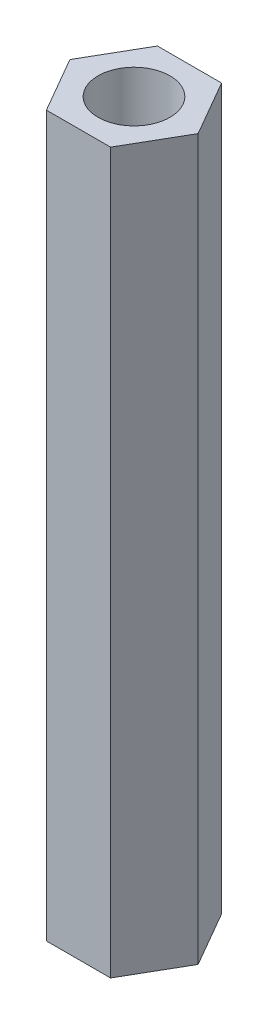
ISO-10303-21;
HEADER;
FILE_DESCRIPTION(('STEP AP214'),'2;1');
FILE_NAME('part.step','',(''),(''),'','','');
FILE_SCHEMA(('AUTOMOTIVE_DESIGN { 1 0 10303 214 1 1 1 1 }'));
ENDSEC;
DATA;
#1=APPLICATION_CONTEXT('core data for automotive mechanical design processes');
#2=APPLICATION_PROTOCOL_DEFINITION('international standard','automotive_design',2000,#1);
#3=PRODUCT_CONTEXT('',#1,'mechanical');
#4=PRODUCT('Part','Part','',(#3));
#5=PRODUCT_RELATED_PRODUCT_CATEGORY('part','',(#4));
#6=PRODUCT_DEFINITION_FORMATION('','',#4);
#7=PRODUCT_DEFINITION_CONTEXT('part definition',#1,'design');
#8=PRODUCT_DEFINITION('design','',#6,#7);
#9=PRODUCT_DEFINITION_SHAPE('','',#8);
#10=(LENGTH_UNIT() NAMED_UNIT(*) SI_UNIT(.MILLI.,.METRE.));
#11=(NAMED_UNIT(*) PLANE_ANGLE_UNIT() SI_UNIT($,.RADIAN.));
#12=(NAMED_UNIT(*) SI_UNIT($,.STERADIAN.) SOLID_ANGLE_UNIT());
#13=UNCERTAINTY_MEASURE_WITH_UNIT(LENGTH_MEASURE(1.E-05),#10,'distance_accuracy_value','');
#14=(GEOMETRIC_REPRESENTATION_CONTEXT(3) GLOBAL_UNCERTAINTY_ASSIGNED_CONTEXT((#13)) GLOBAL_UNIT_ASSIGNED_CONTEXT((#10,
#11,#12)) REPRESENTATION_CONTEXT('',''));
#15=CARTESIAN_POINT('',(0.,0.,0.));
#16=DIRECTION('',(0.,0.,1.));
#17=DIRECTION('',(1.,0.,0.));
#18=AXIS2_PLACEMENT_3D('',#15,#16,#17);
#19=CARTESIAN_POINT('',(0.,30.,0.));
#20=DIRECTION('',(0.,1.,0.));
#21=DIRECTION('',(0.,0.,1.));
#22=AXIS2_PLACEMENT_3D('',#19,#20,#21);
#23=PLANE('',#22);
#24=DIRECTION('',(0.5,0.,-0.866025403784439));
#25=VECTOR('',#24,1.);
#26=CARTESIAN_POINT('',(1.33656587317398,30.,2.315));
#27=LINE('',#26,#25);
#28=CARTESIAN_POINT('',(1.33656587317398,30.,2.315));
#29=VERTEX_POINT('',#28);
#30=CARTESIAN_POINT('',(2.67313174634797,30.,0.));
#31=VERTEX_POINT('',#30);
#32=EDGE_CURVE('E148',#29,#31,#27,.T.);
#33=ORIENTED_EDGE('',*,*,#32,.T.);
#34=DIRECTION('',(-0.5,0.,-0.866025403784438));
#35=VECTOR('',#34,1.);
#36=CARTESIAN_POINT('',(2.67313174634797,30.,0.));
#37=LINE('',#36,#35);
#38=CARTESIAN_POINT('',(1.33656587317398,30.,-2.315));
#39=VERTEX_POINT('',#38);
#40=EDGE_CURVE('E96',#31,#39,#37,.T.);
#41=ORIENTED_EDGE('',*,*,#40,.T.);
#42=DIRECTION('',(-1.,0.,0.));
#43=VECTOR('',#42,1.);
#44=CARTESIAN_POINT('',(1.33656587317398,30.,-2.315));
#45=LINE('',#44,#43);
#46=CARTESIAN_POINT('',(-1.33656587317398,30.,-2.315));
#47=VERTEX_POINT('',#46);
#48=EDGE_CURVE('E109',#39,#47,#45,.T.);
#49=ORIENTED_EDGE('',*,*,#48,.T.);
#50=DIRECTION('',(-0.5,0.,0.866025403784439));
#51=VECTOR('',#50,1.);
#52=CARTESIAN_POINT('',(-1.33656587317398,30.,-2.315));
#53=LINE('',#52,#51);
#54=CARTESIAN_POINT('',(-2.67313174634797,30.,0.));
#55=VERTEX_POINT('',#54);
#56=EDGE_CURVE('E103',#47,#55,#53,.T.);
#57=ORIENTED_EDGE('',*,*,#56,.T.);
#58=DIRECTION('',(0.5,0.,0.866025403784439));
#59=VECTOR('',#58,1.);
#60=CARTESIAN_POINT('',(-2.67313174634797,30.,0.));
#61=LINE('',#60,#59);
#62=CARTESIAN_POINT('',(-1.33656587317398,30.,2.315));
#63=VERTEX_POINT('',#62);
#64=EDGE_CURVE('E107',#55,#63,#61,.T.);
#65=ORIENTED_EDGE('',*,*,#64,.T.);
#66=DIRECTION('',(1.,0.,0.));
#67=VECTOR('',#66,1.);
#68=CARTESIAN_POINT('',(-1.33656587317398,30.,2.315));
#69=LINE('',#68,#67);
#70=EDGE_CURVE('E59',#63,#29,#69,.T.);
#71=ORIENTED_EDGE('',*,*,#70,.T.);
#72=EDGE_LOOP('',(#33,#41,#49,#57,#65,#71));
#73=FACE_BOUND('',#72,.T.);
#74=CARTESIAN_POINT('',(0.,30.,0.));
#75=DIRECTION('',(0.,1.,0.));
#76=DIRECTION('',(0.,0.,1.));
#77=AXIS2_PLACEMENT_3D('',#74,#75,#76);
#78=CIRCLE('',#77,1.5);
#79=CARTESIAN_POINT('',(0.,30.,1.5));
#80=VERTEX_POINT('',#79);
#81=EDGE_CURVE('E136',#80,#80,#78,.T.);
#82=ORIENTED_EDGE('',*,*,#81,.F.);
#83=EDGE_LOOP('',(#82));
#84=FACE_BOUND('',#83,.T.);
#85=ADVANCED_FACE('F41',(#73,#84),#23,.T.);
#86=CARTESIAN_POINT('',(0.,0.,0.));
#87=DIRECTION('',(0.,1.,0.));
#88=DIRECTION('',(0.,0.,1.));
#89=AXIS2_PLACEMENT_3D('',#86,#87,#88);
#90=PLANE('',#89);
#91=DIRECTION('',(0.5,0.,-0.866025403784439));
#92=VECTOR('',#91,1.);
#93=CARTESIAN_POINT('',(1.33656587317398,0.,2.315));
#94=LINE('',#93,#92);
#95=CARTESIAN_POINT('',(1.33656587317398,0.,2.315));
#96=VERTEX_POINT('',#95);
#97=CARTESIAN_POINT('',(2.67313174634797,0.,0.));
#98=VERTEX_POINT('',#97);
#99=EDGE_CURVE('E131',#96,#98,#94,.T.);
#100=ORIENTED_EDGE('',*,*,#99,.F.);
#101=DIRECTION('',(1.,0.,0.));
#102=VECTOR('',#101,1.);
#103=CARTESIAN_POINT('',(-1.33656587317398,0.,2.315));
#104=LINE('',#103,#102);
#105=CARTESIAN_POINT('',(-1.33656587317398,0.,2.315));
#106=VERTEX_POINT('',#105);
#107=EDGE_CURVE('E88',#106,#96,#104,.T.);
#108=ORIENTED_EDGE('',*,*,#107,.F.);
#109=DIRECTION('',(0.5,0.,0.866025403784439));
#110=VECTOR('',#109,1.);
#111=CARTESIAN_POINT('',(-2.67313174634797,0.,0.));
#112=LINE('',#111,#110);
#113=CARTESIAN_POINT('',(-2.67313174634797,0.,0.));
#114=VERTEX_POINT('',#113);
#115=EDGE_CURVE('E82',#114,#106,#112,.T.);
#116=ORIENTED_EDGE('',*,*,#115,.F.);
#117=DIRECTION('',(-0.5,0.,0.866025403784439));
#118=VECTOR('',#117,1.);
#119=CARTESIAN_POINT('',(-1.33656587317398,0.,-2.315));
#120=LINE('',#119,#118);
#121=CARTESIAN_POINT('',(-1.33656587317398,0.,-2.315));
#122=VERTEX_POINT('',#121);
#123=EDGE_CURVE('E118',#122,#114,#120,.T.);
#124=ORIENTED_EDGE('',*,*,#123,.F.);
#125=DIRECTION('',(-1.,0.,0.));
#126=VECTOR('',#125,1.);
#127=CARTESIAN_POINT('',(1.33656587317398,0.,-2.315));
#128=LINE('',#127,#126);
#129=CARTESIAN_POINT('',(1.33656587317398,0.,-2.315));
#130=VERTEX_POINT('',#129);
#131=EDGE_CURVE('E139',#130,#122,#128,.T.);
#132=ORIENTED_EDGE('',*,*,#131,.F.);
#133=DIRECTION('',(-0.5,0.,-0.866025403784438));
#134=VECTOR('',#133,1.);
#135=CARTESIAN_POINT('',(2.67313174634797,0.,0.));
#136=LINE('',#135,#134);
#137=EDGE_CURVE('E135',#98,#130,#136,.T.);
#138=ORIENTED_EDGE('',*,*,#137,.F.);
#139=EDGE_LOOP('',(#100,#108,#116,#124,#132,#138));
#140=FACE_BOUND('',#139,.T.);
#141=CARTESIAN_POINT('',(0.,0.,0.));
#142=DIRECTION('',(0.,1.,0.));
#143=DIRECTION('',(0.,0.,1.));
#144=AXIS2_PLACEMENT_3D('',#141,#142,#143);
#145=CIRCLE('',#144,1.5);
#146=CARTESIAN_POINT('',(0.,0.,1.5));
#147=VERTEX_POINT('',#146);
#148=EDGE_CURVE('E245',#147,#147,#145,.T.);
#149=ORIENTED_EDGE('',*,*,#148,.T.);
#150=EDGE_LOOP('',(#149));
#151=FACE_BOUND('',#150,.T.);
#152=ADVANCED_FACE('F161',(#140,#151),#90,.F.);
#153=CARTESIAN_POINT('',(1.33656587317398,30.,2.315));
#154=DIRECTION('',(-0.866025403784439,0.,-0.5));
#155=DIRECTION('',(-0.5,0.,0.866025403784439));
#156=AXIS2_PLACEMENT_3D('',#153,#154,#155);
#157=PLANE('',#156);
#158=ORIENTED_EDGE('',*,*,#99,.T.);
#159=DIRECTION('',(0.,-1.,0.));
#160=VECTOR('',#159,1.);
#161=CARTESIAN_POINT('',(2.67313174634797,30.,0.));
#162=LINE('',#161,#160);
#163=EDGE_CURVE('E11',#31,#98,#162,.T.);
#164=ORIENTED_EDGE('',*,*,#163,.F.);
#165=ORIENTED_EDGE('',*,*,#32,.F.);
#166=DIRECTION('',(0.,-1.,0.));
#167=VECTOR('',#166,1.);
#168=CARTESIAN_POINT('',(1.33656587317398,30.,2.315));
#169=LINE('',#168,#167);
#170=EDGE_CURVE('E127',#29,#96,#169,.T.);
#171=ORIENTED_EDGE('',*,*,#170,.T.);
#172=EDGE_LOOP('',(#158,#164,#165,#171));
#173=FACE_BOUND('',#172,.T.);
#174=ADVANCED_FACE('F43',(#173),#157,.F.);
#175=CARTESIAN_POINT('',(2.67313174634797,30.,0.));
#176=DIRECTION('',(-0.866025403784438,0.,0.5));
#177=DIRECTION('',(0.5,0.,0.866025403784439));
#178=AXIS2_PLACEMENT_3D('',#175,#176,#177);
#179=PLANE('',#178);
#180=ORIENTED_EDGE('',*,*,#137,.T.);
#181=DIRECTION('',(0.,-1.,0.));
#182=VECTOR('',#181,1.);
#183=CARTESIAN_POINT('',(1.33656587317398,30.,-2.315));
#184=LINE('',#183,#182);
#185=EDGE_CURVE('E51',#39,#130,#184,.T.);
#186=ORIENTED_EDGE('',*,*,#185,.F.);
#187=ORIENTED_EDGE('',*,*,#40,.F.);
#188=ORIENTED_EDGE('',*,*,#163,.T.);
#189=EDGE_LOOP('',(#180,#186,#187,#188));
#190=FACE_BOUND('',#189,.T.);
#191=ADVANCED_FACE('F186',(#190),#179,.F.);
#192=CARTESIAN_POINT('',(1.33656587317398,30.,-2.315));
#193=DIRECTION('',(0.,0.,1.));
#194=DIRECTION('',(1.,0.,0.));
#195=AXIS2_PLACEMENT_3D('',#192,#193,#194);
#196=PLANE('',#195);
#197=ORIENTED_EDGE('',*,*,#131,.T.);
#198=DIRECTION('',(0.,-1.,0.));
#199=VECTOR('',#198,1.);
#200=CARTESIAN_POINT('',(-1.33656587317398,30.,-2.315));
#201=LINE('',#200,#199);
#202=EDGE_CURVE('E120',#47,#122,#201,.T.);
#203=ORIENTED_EDGE('',*,*,#202,.F.);
#204=ORIENTED_EDGE('',*,*,#48,.F.);
#205=ORIENTED_EDGE('',*,*,#185,.T.);
#206=EDGE_LOOP('',(#197,#203,#204,#205));
#207=FACE_BOUND('',#206,.T.);
#208=ADVANCED_FACE('F158',(#207),#196,.F.);
#209=CARTESIAN_POINT('',(-1.33656587317398,30.,-2.315));
#210=DIRECTION('',(0.866025403784439,0.,0.5));
#211=DIRECTION('',(0.5,0.,-0.866025403784439));
#212=AXIS2_PLACEMENT_3D('',#209,#210,#211);
#213=PLANE('',#212);
#214=ORIENTED_EDGE('',*,*,#123,.T.);
#215=DIRECTION('',(0.,-1.,0.));
#216=VECTOR('',#215,1.);
#217=CARTESIAN_POINT('',(-2.67313174634797,30.,0.));
#218=LINE('',#217,#216);
#219=EDGE_CURVE('E115',#55,#114,#218,.T.);
#220=ORIENTED_EDGE('',*,*,#219,.F.);
#221=ORIENTED_EDGE('',*,*,#56,.F.);
#222=ORIENTED_EDGE('',*,*,#202,.T.);
#223=EDGE_LOOP('',(#214,#220,#221,#222));
#224=FACE_BOUND('',#223,.T.);
#225=ADVANCED_FACE('F116',(#224),#213,.F.);
#226=CARTESIAN_POINT('',(-2.67313174634797,30.,0.));
#227=DIRECTION('',(0.866025403784439,0.,-0.5));
#228=DIRECTION('',(-0.5,0.,-0.866025403784439));
#229=AXIS2_PLACEMENT_3D('',#226,#227,#228);
#230=PLANE('',#229);
#231=ORIENTED_EDGE('',*,*,#115,.T.);
#232=DIRECTION('',(0.,-1.,0.));
#233=VECTOR('',#232,1.);
#234=CARTESIAN_POINT('',(-1.33656587317398,30.,2.315));
#235=LINE('',#234,#233);
#236=EDGE_CURVE('E121',#63,#106,#235,.T.);
#237=ORIENTED_EDGE('',*,*,#236,.F.);
#238=ORIENTED_EDGE('',*,*,#64,.F.);
#239=ORIENTED_EDGE('',*,*,#219,.T.);
#240=EDGE_LOOP('',(#231,#237,#238,#239));
#241=FACE_BOUND('',#240,.T.);
#242=ADVANCED_FACE('F123',(#241),#230,.F.);
#243=CARTESIAN_POINT('',(-1.33656587317398,30.,2.315));
#244=DIRECTION('',(0.,0.,-1.));
#245=DIRECTION('',(-1.,0.,0.));
#246=AXIS2_PLACEMENT_3D('',#243,#244,#245);
#247=PLANE('',#246);
#248=ORIENTED_EDGE('',*,*,#107,.T.);
#249=ORIENTED_EDGE('',*,*,#170,.F.);
#250=ORIENTED_EDGE('',*,*,#70,.F.);
#251=ORIENTED_EDGE('',*,*,#236,.T.);
#252=EDGE_LOOP('',(#248,#249,#250,#251));
#253=FACE_BOUND('',#252,.T.);
#254=ADVANCED_FACE('F166',(#253),#247,.F.);
#255=CARTESIAN_POINT('',(0.,30.,0.));
#256=DIRECTION('',(0.,-1.,0.));
#257=DIRECTION('',(0.,0.,-1.));
#258=AXIS2_PLACEMENT_3D('',#255,#256,#257);
#259=CYLINDRICAL_SURFACE('',#258,1.5);
#260=ORIENTED_EDGE('',*,*,#81,.T.);
#261=EDGE_LOOP('',(#260));
#262=FACE_BOUND('',#261,.T.);
#263=ORIENTED_EDGE('',*,*,#148,.F.);
#264=EDGE_LOOP('',(#263));
#265=FACE_BOUND('',#264,.T.);
#266=ADVANCED_FACE('F168',(#262,#265),#259,.F.);
#267=CLOSED_SHELL('',(#85,#152,#174,#191,#208,#225,#242,#254,#266));
#268=MANIFOLD_SOLID_BREP('B2',#267);
#269=ADVANCED_BREP_SHAPE_REPRESENTATION('',(#18,#268),#14);
#270=SHAPE_DEFINITION_REPRESENTATION(#9,#269);
ENDSEC;
END-ISO-10303-21;
